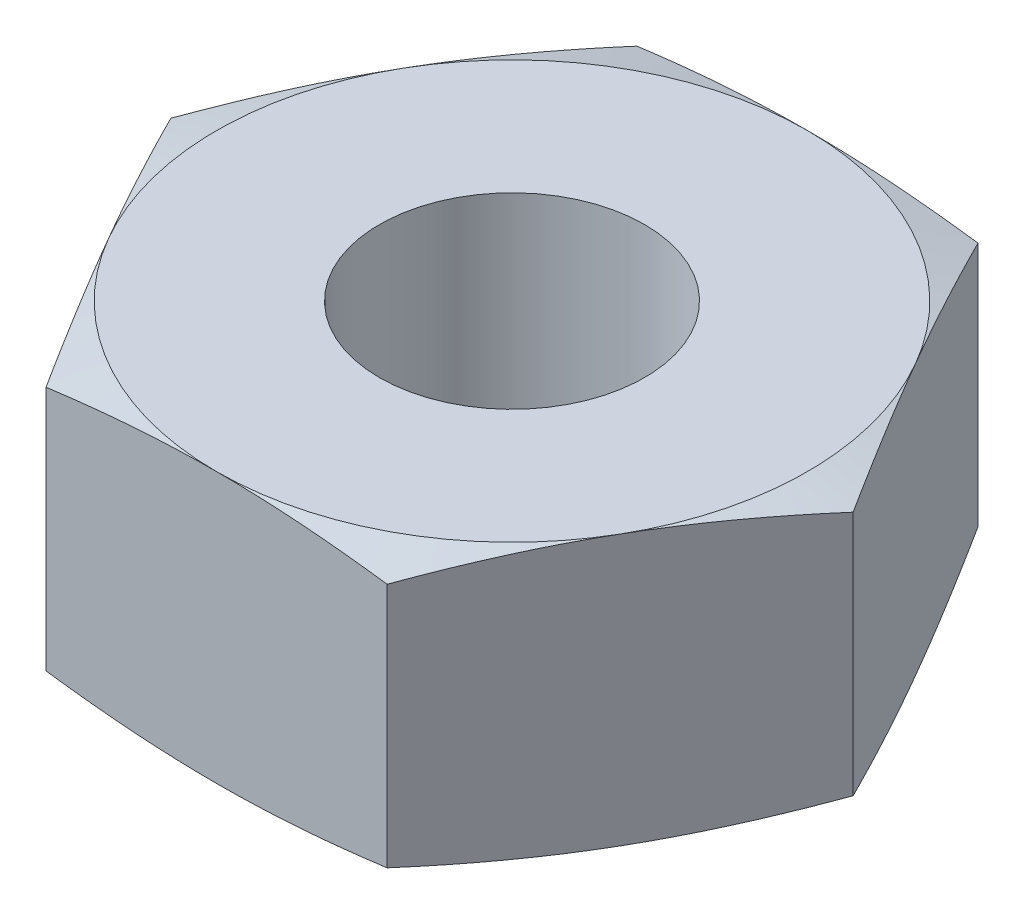
ISO-10303-21;
HEADER;
FILE_DESCRIPTION(('STEP AP214'),'2;1');
FILE_NAME('part.step','',(''),(''),'','','');
FILE_SCHEMA(('AUTOMOTIVE_DESIGN { 1 0 10303 214 1 1 1 1 }'));
ENDSEC;
DATA;
#1=APPLICATION_CONTEXT('core data for automotive mechanical design processes');
#2=APPLICATION_PROTOCOL_DEFINITION('international standard','automotive_design',2000,#1);
#3=PRODUCT_CONTEXT('',#1,'mechanical');
#4=PRODUCT('Part','Part','',(#3));
#5=PRODUCT_RELATED_PRODUCT_CATEGORY('part','',(#4));
#6=PRODUCT_DEFINITION_FORMATION('','',#4);
#7=PRODUCT_DEFINITION_CONTEXT('part definition',#1,'design');
#8=PRODUCT_DEFINITION('design','',#6,#7);
#9=PRODUCT_DEFINITION_SHAPE('','',#8);
#10=(LENGTH_UNIT() NAMED_UNIT(*) SI_UNIT(.MILLI.,.METRE.));
#11=(NAMED_UNIT(*) PLANE_ANGLE_UNIT() SI_UNIT($,.RADIAN.));
#12=(NAMED_UNIT(*) SI_UNIT($,.STERADIAN.) SOLID_ANGLE_UNIT());
#13=UNCERTAINTY_MEASURE_WITH_UNIT(LENGTH_MEASURE(1.E-05),#10,'distance_accuracy_value','');
#14=(GEOMETRIC_REPRESENTATION_CONTEXT(3) GLOBAL_UNCERTAINTY_ASSIGNED_CONTEXT((#13)) GLOBAL_UNIT_ASSIGNED_CONTEXT((#10,
#11,#12)) REPRESENTATION_CONTEXT('',''));
#15=CARTESIAN_POINT('',(0.,0.,0.));
#16=DIRECTION('',(0.,0.,1.));
#17=DIRECTION('',(1.,0.,0.));
#18=AXIS2_PLACEMENT_3D('',#15,#16,#17);
#19=CARTESIAN_POINT('',(2.02072594216369,1.6,3.5));
#20=DIRECTION('',(-0.866025403784439,0.,-0.5));
#21=DIRECTION('',(-0.5,0.,0.866025403784439));
#22=AXIS2_PLACEMENT_3D('',#19,#20,#21);
#23=PLANE('',#22);
#24=CARTESIAN_POINT('',(4.04156735438122,-1.45488746342053,-0.000199999999999409));
#25=CARTESIAN_POINT('',(3.95764212282385,-1.47738559382203,0.145162765094346));
#26=CARTESIAN_POINT('',(3.87356471593575,-1.49781025450599,0.290789105593173));
#27=CARTESIAN_POINT('',(3.70511294932748,-1.53369455339474,0.582556123983438));
#28=CARTESIAN_POINT('',(3.62073848299856,-1.54915217450553,0.728696986526637));
#29=CARTESIAN_POINT('',(3.45220420868617,-1.57419991225359,1.02060691245245));
#30=CARTESIAN_POINT('',(3.3680455405573,-1.58381990209049,1.16637400154898));
#31=CARTESIAN_POINT('',(3.19962087008055,-1.59671933246687,1.45809408806274));
#32=CARTESIAN_POINT('',(3.11535489166304,-1.60000000000001,1.60404704403137));
#33=CARTESIAN_POINT('',(2.94682293482803,-1.60000000000001,1.89595295596863));
#34=CARTESIAN_POINT('',(2.86255695641052,-1.59671933246687,2.04190591193726));
#35=CARTESIAN_POINT('',(2.69413228593377,-1.58381990209049,2.33362599845102));
#36=CARTESIAN_POINT('',(2.6099736178049,-1.57419991225359,2.47939308754756));
#37=CARTESIAN_POINT('',(2.44143934349251,-1.54915217450553,2.77130301347336));
#38=CARTESIAN_POINT('',(2.35706487716359,-1.53369455339474,2.91744387601656));
#39=CARTESIAN_POINT('',(2.18861311055532,-1.49781025450599,3.20921089440683));
#40=CARTESIAN_POINT('',(2.10453570366722,-1.47738559382203,3.35483723490566));
#41=CARTESIAN_POINT('',(2.02061047210985,-1.45488746342053,3.5002));
#42=B_SPLINE_CURVE_WITH_KNOTS('',3,(#24,#25,#26,#27,#28,#29,#30,#31,#32,#33,#34,#35,#36,#37,#38,
#39,#40,#41),.UNSPECIFIED.,.F.,.F.,(4,2,2,2,2,2,2,2,4),(0.,0.508081243376834,1.01636855642799,
1.52203235492776,2.02759827097034,2.53316418701292,3.03882798551268,3.54711529856384,
4.05519654194067),.UNSPECIFIED.);
#43=CARTESIAN_POINT('',(4.04145188432738,-1.45491840485418,0.));
#44=VERTEX_POINT('',#43);
#45=CARTESIAN_POINT('',(3.03108891324554,-1.6,1.75));
#46=VERTEX_POINT('',#45);
#47=EDGE_CURVE('E54',#44,#46,#42,.T.);
#48=ORIENTED_EDGE('',*,*,#47,.F.);
#49=DIRECTION('',(0.,-1.,0.));
#50=VECTOR('',#49,1.);
#51=CARTESIAN_POINT('',(4.04145188432738,1.6,0.));
#52=LINE('',#51,#50);
#53=CARTESIAN_POINT('',(4.04145188432738,1.45491840485418,0.));
#54=VERTEX_POINT('',#53);
#55=EDGE_CURVE('E171',#54,#44,#52,.T.);
#56=ORIENTED_EDGE('',*,*,#55,.F.);
#57=CARTESIAN_POINT('',(2.02061047210985,1.45488746342053,3.5002));
#58=CARTESIAN_POINT('',(2.10453570366722,1.47738559382203,3.35483723490566));
#59=CARTESIAN_POINT('',(2.18861311055532,1.49781025450599,3.20921089440683));
#60=CARTESIAN_POINT('',(2.35706487716359,1.53369455339474,2.91744387601656));
#61=CARTESIAN_POINT('',(2.44143934349251,1.54915217450553,2.77130301347337));
#62=CARTESIAN_POINT('',(2.6099736178049,1.57419991225359,2.47939308754756));
#63=CARTESIAN_POINT('',(2.69413228593377,1.58381990209049,2.33362599845102));
#64=CARTESIAN_POINT('',(2.86255695641052,1.59671933246687,2.04190591193726));
#65=CARTESIAN_POINT('',(2.94682293482802,1.6,1.89595295596863));
#66=CARTESIAN_POINT('',(3.11535489166304,1.6,1.60404704403137));
#67=CARTESIAN_POINT('',(3.19962087008055,1.59671933246687,1.45809408806274));
#68=CARTESIAN_POINT('',(3.3680455405573,1.58381990209049,1.16637400154898));
#69=CARTESIAN_POINT('',(3.45220420868617,1.57419991225359,1.02060691245245));
#70=CARTESIAN_POINT('',(3.62073848299856,1.54915217450553,0.728696986526638));
#71=CARTESIAN_POINT('',(3.70511294932748,1.53369455339474,0.582556123983439));
#72=CARTESIAN_POINT('',(3.87356471593575,1.49781025450599,0.290789105593173));
#73=CARTESIAN_POINT('',(3.95764212282385,1.47738559382203,0.145162765094347));
#74=CARTESIAN_POINT('',(4.04156735438122,1.45488746342054,-0.000199999999998981));
#75=B_SPLINE_CURVE_WITH_KNOTS('',3,(#57,#58,#59,#60,#61,#62,#63,#64,#65,#66,#67,#68,#69,#70,#71,
#72,#73,#74),.UNSPECIFIED.,.F.,.F.,(4,2,2,2,2,2,2,2,4),(0.,0.508081243376833,1.01636855642799,
1.52203235492776,2.02759827097034,2.53316418701292,3.03882798551268,3.54711529856384,
4.05519654194067),.UNSPECIFIED.);
#76=CARTESIAN_POINT('',(3.03108891324554,1.6,1.75));
#77=VERTEX_POINT('',#76);
#78=EDGE_CURVE('E262',#77,#54,#75,.T.);
#79=ORIENTED_EDGE('',*,*,#78,.F.);
#80=CARTESIAN_POINT('',(2.0207259421637,1.45491840485418,3.5));
#81=VERTEX_POINT('',#80);
#82=EDGE_CURVE('E162',#81,#77,#75,.T.);
#83=ORIENTED_EDGE('',*,*,#82,.F.);
#84=DIRECTION('',(0.,-1.,0.));
#85=VECTOR('',#84,1.);
#86=CARTESIAN_POINT('',(2.02072594216369,1.6,3.5));
#87=LINE('',#86,#85);
#88=CARTESIAN_POINT('',(2.0207259421637,-1.45491840485418,3.5));
#89=VERTEX_POINT('',#88);
#90=EDGE_CURVE('E157',#81,#89,#87,.T.);
#91=ORIENTED_EDGE('',*,*,#90,.T.);
#92=EDGE_CURVE('E149',#46,#89,#42,.T.);
#93=ORIENTED_EDGE('',*,*,#92,.F.);
#94=EDGE_LOOP('',(#48,#56,#79,#83,#91,#93));
#95=FACE_BOUND('',#94,.T.);
#96=ADVANCED_FACE('F38',(#95),#23,.F.);
#97=CARTESIAN_POINT('',(4.04145188432738,1.6,0.));
#98=DIRECTION('',(-0.866025403784439,0.,0.5));
#99=DIRECTION('',(0.5,0.,0.866025403784439));
#100=AXIS2_PLACEMENT_3D('',#97,#98,#99);
#101=PLANE('',#100);
#102=CARTESIAN_POINT('',(2.02061047210985,-1.45488746342053,-3.5002));
#103=CARTESIAN_POINT('',(2.10453570366722,-1.47738559382203,-3.35483723490565));
#104=CARTESIAN_POINT('',(2.18861311055532,-1.49781025450599,-3.20921089440683));
#105=CARTESIAN_POINT('',(2.35706487716359,-1.53369455339474,-2.91744387601656));
#106=CARTESIAN_POINT('',(2.44143934349251,-1.54915217450553,-2.77130301347336));
#107=CARTESIAN_POINT('',(2.6099736178049,-1.57419991225359,-2.47939308754755));
#108=CARTESIAN_POINT('',(2.69413228593377,-1.58381990209049,-2.33362599845102));
#109=CARTESIAN_POINT('',(2.86255695641052,-1.59671933246687,-2.04190591193726));
#110=CARTESIAN_POINT('',(2.94682293482803,-1.6,-1.89595295596863));
#111=CARTESIAN_POINT('',(3.11535489166304,-1.6,-1.60404704403137));
#112=CARTESIAN_POINT('',(3.19962087008055,-1.59671933246687,-1.45809408806274));
#113=CARTESIAN_POINT('',(3.3680455405573,-1.58381990209049,-1.16637400154898));
#114=CARTESIAN_POINT('',(3.45220420868617,-1.57419991225359,-1.02060691245245));
#115=CARTESIAN_POINT('',(3.62073848299856,-1.54915217450553,-0.728696986526637));
#116=CARTESIAN_POINT('',(3.70511294932748,-1.53369455339474,-0.582556123983437));
#117=CARTESIAN_POINT('',(3.87356471593575,-1.49781025450599,-0.290789105593172));
#118=CARTESIAN_POINT('',(3.95764212282385,-1.47738559382203,-0.145162765094346));
#119=CARTESIAN_POINT('',(4.04156735438122,-1.45488746342054,0.000200000000000651));
#120=B_SPLINE_CURVE_WITH_KNOTS('',3,(#102,#103,#104,#105,#106,#107,#108,#109,#110,#111,#112,
#113,#114,#115,#116,#117,#118,#119),.UNSPECIFIED.,.F.,.F.,(4,2,2,2,2,2,2,2,4),(0.,
0.508081243376834,1.016368556428,1.52203235492776,2.02759827097034,2.53316418701292,
3.03882798551268,3.54711529856384,4.05519654194067),.UNSPECIFIED.);
#121=CARTESIAN_POINT('',(2.02072594216369,-1.45491840485418,-3.50000000000001));
#122=VERTEX_POINT('',#121);
#123=CARTESIAN_POINT('',(3.03108891324554,-1.6,-1.75));
#124=VERTEX_POINT('',#123);
#125=EDGE_CURVE('E61',#122,#124,#120,.T.);
#126=ORIENTED_EDGE('',*,*,#125,.F.);
#127=DIRECTION('',(0.,-1.,0.));
#128=VECTOR('',#127,1.);
#129=CARTESIAN_POINT('',(2.02072594216369,1.6,-3.5));
#130=LINE('',#129,#128);
#131=CARTESIAN_POINT('',(2.0207259421637,1.45491840485418,-3.5));
#132=VERTEX_POINT('',#131);
#133=EDGE_CURVE('E168',#132,#122,#130,.T.);
#134=ORIENTED_EDGE('',*,*,#133,.F.);
#135=CARTESIAN_POINT('',(4.04156735438122,1.45488746342053,0.000200000000000182));
#136=CARTESIAN_POINT('',(3.95764212282385,1.47738559382203,-0.145162765094346));
#137=CARTESIAN_POINT('',(3.87356471593575,1.49781025450599,-0.290789105593172));
#138=CARTESIAN_POINT('',(3.70511294932748,1.53369455339474,-0.582556123983438));
#139=CARTESIAN_POINT('',(3.62073848299856,1.54915217450553,-0.728696986526637));
#140=CARTESIAN_POINT('',(3.45220420868617,1.57419991225359,-1.02060691245245));
#141=CARTESIAN_POINT('',(3.3680455405573,1.58381990209049,-1.16637400154898));
#142=CARTESIAN_POINT('',(3.19962087008055,1.59671933246687,-1.45809408806274));
#143=CARTESIAN_POINT('',(3.11535489166304,1.60000000000001,-1.60404704403137));
#144=CARTESIAN_POINT('',(2.94682293482803,1.60000000000001,-1.89595295596863));
#145=CARTESIAN_POINT('',(2.86255695641052,1.59671933246687,-2.04190591193726));
#146=CARTESIAN_POINT('',(2.69413228593377,1.58381990209049,-2.33362599845102));
#147=CARTESIAN_POINT('',(2.6099736178049,1.57419991225359,-2.47939308754755));
#148=CARTESIAN_POINT('',(2.44143934349251,1.54915217450553,-2.77130301347336));
#149=CARTESIAN_POINT('',(2.35706487716359,1.53369455339474,-2.91744387601656));
#150=CARTESIAN_POINT('',(2.18861311055532,1.49781025450599,-3.20921089440683));
#151=CARTESIAN_POINT('',(2.10453570366722,1.47738559382203,-3.35483723490565));
#152=CARTESIAN_POINT('',(2.02061047210985,1.45488746342053,-3.5002));
#153=B_SPLINE_CURVE_WITH_KNOTS('',3,(#135,#136,#137,#138,#139,#140,#141,#142,#143,#144,#145,
#146,#147,#148,#149,#150,#151,#152),.UNSPECIFIED.,.F.,.F.,(4,2,2,2,2,2,2,2,4),(0.,
0.508081243376834,1.01636855642799,1.52203235492776,2.02759827097034,2.53316418701292,
3.03882798551268,3.54711529856384,4.05519654194067),.UNSPECIFIED.);
#154=CARTESIAN_POINT('',(3.03108891324554,1.6,-1.75));
#155=VERTEX_POINT('',#154);
#156=EDGE_CURVE('E256',#155,#132,#153,.T.);
#157=ORIENTED_EDGE('',*,*,#156,.F.);
#158=EDGE_CURVE('E260',#54,#155,#153,.T.);
#159=ORIENTED_EDGE('',*,*,#158,.F.);
#160=ORIENTED_EDGE('',*,*,#55,.T.);
#161=EDGE_CURVE('E274',#124,#44,#120,.T.);
#162=ORIENTED_EDGE('',*,*,#161,.F.);
#163=EDGE_LOOP('',(#126,#134,#157,#159,#160,#162));
#164=FACE_BOUND('',#163,.T.);
#165=ADVANCED_FACE('F266',(#164),#101,.F.);
#166=CARTESIAN_POINT('',(2.02072594216369,1.6,-3.5));
#167=DIRECTION('',(0.,0.,1.));
#168=DIRECTION('',(1.,0.,0.));
#169=AXIS2_PLACEMENT_3D('',#166,#167,#168);
#170=PLANE('',#169);
#171=CARTESIAN_POINT('',(-5.44794165387883,-0.802759219121572,-3.5));
#172=CARTESIAN_POINT('',(-5.28787944005606,-0.838833506686663,-3.5));
#173=CARTESIAN_POINT('',(-5.12771986140729,-0.874483249848462,-3.5));
#174=CARTESIAN_POINT('',(-4.80715789763999,-0.944704151216025,-3.5));
#175=CARTESIAN_POINT('',(-4.64675550294617,-0.979275265660306,-3.5));
#176=CARTESIAN_POINT('',(-4.32553499190003,-1.04713556451647,-3.5));
#177=CARTESIAN_POINT('',(-4.16471663689008,-1.08042362309612,-3.5));
#178=CARTESIAN_POINT('',(-3.84275237191593,-1.14537529032003,-3.5));
#179=CARTESIAN_POINT('',(-3.6816064645399,-1.17703891174843,-3.5));
#180=CARTESIAN_POINT('',(-3.36037189085155,-1.23807830273547,-3.5));
#181=CARTESIAN_POINT('',(-3.20028664501665,-1.26747198826896,-3.5));
#182=CARTESIAN_POINT('',(-2.87968547460581,-1.32380413242379,-3.5));
#183=CARTESIAN_POINT('',(-2.71916955912038,-1.35074264245544,-3.5));
#184=CARTESIAN_POINT('',(-2.39766115808484,-1.40158045759508,-3.5));
#185=CARTESIAN_POINT('',(-2.2366686962566,-1.42547991146413,-3.5));
#186=CARTESIAN_POINT('',(-1.91416660910466,-1.4695545661189,-3.5));
#187=CARTESIAN_POINT('',(-1.75265697552332,-1.48972970713404,-3.5));
#188=CARTESIAN_POINT('',(-1.42723816414199,-1.52580995624861,-3.5));
#189=CARTESIAN_POINT('',(-1.26332304518374,-1.54166225930532,-3.5));
#190=CARTESIAN_POINT('',(-0.935069761815876,-1.5680139939947,-3.5));
#191=CARTESIAN_POINT('',(-0.77073163526216,-1.57851388895893,-3.5));
#192=CARTESIAN_POINT('',(-0.441865309169314,-1.59355196935843,-3.5));
#193=CARTESIAN_POINT('',(-0.277337258285922,-1.5980933401484,-3.5));
#194=CARTESIAN_POINT('',(0.0517733682332413,-1.60093312640938,-3.5));
#195=CARTESIAN_POINT('',(0.216355943705047,-1.5992315604867,-3.5));
#196=CARTESIAN_POINT('',(0.546098106792446,-1.58967493352251,-3.5));
#197=CARTESIAN_POINT('',(0.71125685625703,-1.58179153808297,-3.5));
#198=CARTESIAN_POINT('',(1.0412049060427,-1.56032278027866,-3.5));
#199=CARTESIAN_POINT('',(1.20599418623684,-1.54673711452056,-3.5));
#200=CARTESIAN_POINT('',(1.53520132339961,-1.51457518215612,-3.5));
#201=CARTESIAN_POINT('',(1.6996188117597,-1.49599520158007,-3.5));
#202=CARTESIAN_POINT('',(2.02791869152128,-1.45464926155375,-3.5));
#203=CARTESIAN_POINT('',(2.1918010855413,-1.43188332261903,-3.5));
#204=CARTESIAN_POINT('',(2.55773878979597,-1.37714075022119,-3.5));
#205=CARTESIAN_POINT('',(2.75965770767667,-1.3442590576039,-3.5));
#206=CARTESIAN_POINT('',(3.16280506821541,-1.2744860233325,-3.5));
#207=CARTESIAN_POINT('',(3.36403346893582,-1.23759444243856,-3.5));
#208=CARTESIAN_POINT('',(3.76594446303811,-1.16074821773512,-3.5));
#209=CARTESIAN_POINT('',(3.96662693324336,-1.1207929338427,-3.5));
#210=CARTESIAN_POINT('',(4.36751204510024,-1.03853651336037,-3.5));
#211=CARTESIAN_POINT('',(4.56771467692626,-0.996235329154601,-3.5));
#212=CARTESIAN_POINT('',(5.16798904024747,-0.866594178897146,-3.5));
#213=CARTESIAN_POINT('',(5.56747861340178,-0.776565670724137,-3.5));
#214=CARTESIAN_POINT('',(6.3653799972808,-0.592138243986172,-3.5));
#215=CARTESIAN_POINT('',(6.76379194254003,-0.497739900407909,-3.5));
#216=CARTESIAN_POINT('',(7.55369204976309,-0.307578244870878,-3.5));
#217=CARTESIAN_POINT('',(7.94519095111558,-0.211859444351146,-3.5));
#218=CARTESIAN_POINT('',(8.72773476710705,-0.018522164870488,-3.5));
#219=CARTESIAN_POINT('',(9.11877966270979,0.0790963909001356,-3.5));
#220=CARTESIAN_POINT('',(9.89975451609434,0.275477181032252,-3.5));
#221=CARTESIAN_POINT('',(10.2896851442499,0.374236753673143,-3.5));
#222=CARTESIAN_POINT('',(11.0692718287081,0.572750394754799,-3.5));
#223=CARTESIAN_POINT('',(11.4589278981786,0.672504411453289,-3.5));
#224=CARTESIAN_POINT('',(11.8484975559015,0.772591086769964,-3.5));
#225=B_SPLINE_CURVE_WITH_KNOTS('',3,(#171,#172,#173,#174,#175,#176,#177,#178,#179,#180,#181,
#182,#183,#184,#185,#186,#187,#188,#189,#190,#191,#192,#193,#194,#195,#196,#197,#198,#199,#200,
#201,#202,#203,#204,#205,#206,#207,#208,#209,#210,#211,#212,#213,#214,#215,#216,#217,#218,#219,
#220,#221,#222,#223,#224),.UNSPECIFIED.,.F.,.F.,(4,2,2,2,2,2,2,2,2,2,2,2,2,2,2,2,2,2,2,2,2,2,2,
2,2,2,4),(0.,0.492232922608383,0.984485789897494,1.47716118860718,1.96983270942275,
2.45810167830622,2.94636042069629,3.43459525373252,3.92283792164948,4.41680166455133,
4.91072264018276,5.40437946392539,5.89803481638425,6.39396615707215,6.88992388748396,
7.38625145689028,7.88257659383844,8.4962570871316,9.10997421423646,9.72381991315014,
10.3376780761461,11.56615452824,12.7944697932781,14.0035535640047,15.2126863216193,
16.4194135198414,17.6260782547595),.UNSPECIFIED.);
#226=CARTESIAN_POINT('',(-2.02072594216369,-1.45491840485418,-3.50000000000001));
#227=VERTEX_POINT('',#226);
#228=CARTESIAN_POINT('',(0.,-1.6,-3.5));
#229=VERTEX_POINT('',#228);
#230=EDGE_CURVE('E289',#227,#229,#225,.T.);
#231=ORIENTED_EDGE('',*,*,#230,.F.);
#232=DIRECTION('',(0.,-1.,0.));
#233=VECTOR('',#232,1.);
#234=CARTESIAN_POINT('',(-2.02072594216369,1.6,-3.5));
#235=LINE('',#234,#233);
#236=CARTESIAN_POINT('',(-2.02072594216369,1.45491840485418,-3.50000000000001));
#237=VERTEX_POINT('',#236);
#238=EDGE_CURVE('E159',#237,#227,#235,.T.);
#239=ORIENTED_EDGE('',*,*,#238,.F.);
#240=CARTESIAN_POINT('',(-5.44794165387883,0.802759219121572,-3.5));
#241=CARTESIAN_POINT('',(-5.28787944005606,0.838833506686663,-3.5));
#242=CARTESIAN_POINT('',(-5.12771986140729,0.874483249848462,-3.5));
#243=CARTESIAN_POINT('',(-4.80715789763999,0.944704151216025,-3.5));
#244=CARTESIAN_POINT('',(-4.64675550294617,0.979275265660306,-3.5));
#245=CARTESIAN_POINT('',(-4.32553499190003,1.04713556451647,-3.5));
#246=CARTESIAN_POINT('',(-4.16471663689008,1.08042362309612,-3.5));
#247=CARTESIAN_POINT('',(-3.84275237191593,1.14537529032003,-3.5));
#248=CARTESIAN_POINT('',(-3.6816064645399,1.17703891174843,-3.5));
#249=CARTESIAN_POINT('',(-3.36037189085155,1.23807830273547,-3.5));
#250=CARTESIAN_POINT('',(-3.20028664501665,1.26747198826896,-3.5));
#251=CARTESIAN_POINT('',(-2.87968547460581,1.32380413242379,-3.5));
#252=CARTESIAN_POINT('',(-2.71916955912038,1.35074264245544,-3.5));
#253=CARTESIAN_POINT('',(-2.39766115808484,1.40158045759508,-3.5));
#254=CARTESIAN_POINT('',(-2.2366686962566,1.42547991146413,-3.5));
#255=CARTESIAN_POINT('',(-1.91416660910466,1.4695545661189,-3.5));
#256=CARTESIAN_POINT('',(-1.75265697552332,1.48972970713404,-3.5));
#257=CARTESIAN_POINT('',(-1.42723816414199,1.52580995624861,-3.5));
#258=CARTESIAN_POINT('',(-1.26332304518374,1.54166225930532,-3.5));
#259=CARTESIAN_POINT('',(-0.935069761815876,1.5680139939947,-3.5));
#260=CARTESIAN_POINT('',(-0.77073163526216,1.57851388895893,-3.5));
#261=CARTESIAN_POINT('',(-0.441865309169314,1.59355196935843,-3.5));
#262=CARTESIAN_POINT('',(-0.277337258285922,1.5980933401484,-3.5));
#263=CARTESIAN_POINT('',(0.0517733682332413,1.60093312640938,-3.5));
#264=CARTESIAN_POINT('',(0.216355943705047,1.5992315604867,-3.5));
#265=CARTESIAN_POINT('',(0.546098106792446,1.58967493352251,-3.5));
#266=CARTESIAN_POINT('',(0.71125685625703,1.58179153808297,-3.5));
#267=CARTESIAN_POINT('',(1.0412049060427,1.56032278027866,-3.5));
#268=CARTESIAN_POINT('',(1.20599418623684,1.54673711452056,-3.5));
#269=CARTESIAN_POINT('',(1.53520132339961,1.51457518215612,-3.5));
#270=CARTESIAN_POINT('',(1.6996188117597,1.49599520158007,-3.5));
#271=CARTESIAN_POINT('',(2.02791869152128,1.45464926155375,-3.5));
#272=CARTESIAN_POINT('',(2.1918010855413,1.43188332261903,-3.5));
#273=CARTESIAN_POINT('',(2.55773878979597,1.37714075022119,-3.5));
#274=CARTESIAN_POINT('',(2.75965770767667,1.3442590576039,-3.5));
#275=CARTESIAN_POINT('',(3.16280506821541,1.2744860233325,-3.5));
#276=CARTESIAN_POINT('',(3.36403346893582,1.23759444243856,-3.5));
#277=CARTESIAN_POINT('',(3.76594446303811,1.16074821773512,-3.5));
#278=CARTESIAN_POINT('',(3.96662693324336,1.1207929338427,-3.5));
#279=CARTESIAN_POINT('',(4.36751204510024,1.03853651336037,-3.5));
#280=CARTESIAN_POINT('',(4.56771467692626,0.996235329154601,-3.5));
#281=CARTESIAN_POINT('',(5.16798904024747,0.866594178897146,-3.5));
#282=CARTESIAN_POINT('',(5.56747861340178,0.776565670724137,-3.5));
#283=CARTESIAN_POINT('',(6.3653799972808,0.592138243986172,-3.5));
#284=CARTESIAN_POINT('',(6.76379194254003,0.497739900407909,-3.5));
#285=CARTESIAN_POINT('',(7.55369204976309,0.307578244870878,-3.5));
#286=CARTESIAN_POINT('',(7.94519095111558,0.211859444351146,-3.5));
#287=CARTESIAN_POINT('',(8.72773476710705,0.018522164870488,-3.5));
#288=CARTESIAN_POINT('',(9.11877966270979,-0.0790963909001356,-3.5));
#289=CARTESIAN_POINT('',(9.89975451609434,-0.275477181032252,-3.5));
#290=CARTESIAN_POINT('',(10.2896851442499,-0.374236753673143,-3.5));
#291=CARTESIAN_POINT('',(11.0692718287081,-0.572750394754799,-3.5));
#292=CARTESIAN_POINT('',(11.4589278981786,-0.672504411453289,-3.5));
#293=CARTESIAN_POINT('',(11.8484975559015,-0.772591086769964,-3.5));
#294=B_SPLINE_CURVE_WITH_KNOTS('',3,(#240,#241,#242,#243,#244,#245,#246,#247,#248,#249,#250,
#251,#252,#253,#254,#255,#256,#257,#258,#259,#260,#261,#262,#263,#264,#265,#266,#267,#268,#269,
#270,#271,#272,#273,#274,#275,#276,#277,#278,#279,#280,#281,#282,#283,#284,#285,#286,#287,#288,
#289,#290,#291,#292,#293),.UNSPECIFIED.,.F.,.F.,(4,2,2,2,2,2,2,2,2,2,2,2,2,2,2,2,2,2,2,2,2,2,2,
2,2,2,4),(0.,0.492232922608383,0.984485789897494,1.47716118860718,1.96983270942275,
2.45810167830622,2.94636042069629,3.43459525373252,3.92283792164948,4.41680166455133,
4.91072264018276,5.40437946392539,5.89803481638425,6.39396615707215,6.88992388748396,
7.38625145689028,7.88257659383844,8.4962570871316,9.10997421423646,9.72381991315014,
10.3376780761461,11.56615452824,12.7944697932781,14.0035535640047,15.2126863216193,
16.4194135198414,17.6260782547595),.UNSPECIFIED.);
#295=CARTESIAN_POINT('',(0.,1.6,-3.5));
#296=VERTEX_POINT('',#295);
#297=EDGE_CURVE('E213',#296,#237,#294,.F.);
#298=ORIENTED_EDGE('',*,*,#297,.F.);
#299=EDGE_CURVE('E261',#132,#296,#294,.F.);
#300=ORIENTED_EDGE('',*,*,#299,.F.);
#301=ORIENTED_EDGE('',*,*,#133,.T.);
#302=EDGE_CURVE('E285',#229,#122,#225,.T.);
#303=ORIENTED_EDGE('',*,*,#302,.F.);
#304=EDGE_LOOP('',(#231,#239,#298,#300,#301,#303));
#305=FACE_BOUND('',#304,.T.);
#306=ADVANCED_FACE('F269',(#305),#170,.F.);
#307=CARTESIAN_POINT('',(-2.02072594216369,1.6,-3.5));
#308=DIRECTION('',(0.866025403784439,0.,0.5));
#309=DIRECTION('',(0.5,0.,-0.866025403784439));
#310=AXIS2_PLACEMENT_3D('',#307,#308,#309);
#311=PLANE('',#310);
#312=CARTESIAN_POINT('',(-4.04156735438122,-1.45488746342053,0.000199999999999236));
#313=CARTESIAN_POINT('',(-3.95764212282385,-1.47738559382203,-0.145162765094347));
#314=CARTESIAN_POINT('',(-3.87356471593575,-1.49781025450599,-0.290789105593173));
#315=CARTESIAN_POINT('',(-3.70511294932748,-1.53369455339474,-0.582556123983438));
#316=CARTESIAN_POINT('',(-3.62073848299856,-1.54915217450553,-0.728696986526637));
#317=CARTESIAN_POINT('',(-3.45220420868617,-1.57419991225359,-1.02060691245245));
#318=CARTESIAN_POINT('',(-3.3680455405573,-1.58381990209049,-1.16637400154898));
#319=CARTESIAN_POINT('',(-3.19962087008055,-1.59671933246687,-1.45809408806274));
#320=CARTESIAN_POINT('',(-3.11535489166305,-1.60000000000001,-1.60404704403137));
#321=CARTESIAN_POINT('',(-2.94682293482803,-1.60000000000001,-1.89595295596863));
#322=CARTESIAN_POINT('',(-2.86255695641052,-1.59671933246687,-2.04190591193726));
#323=CARTESIAN_POINT('',(-2.69413228593377,-1.58381990209049,-2.33362599845102));
#324=CARTESIAN_POINT('',(-2.6099736178049,-1.57419991225359,-2.47939308754756));
#325=CARTESIAN_POINT('',(-2.44143934349251,-1.54915217450553,-2.77130301347336));
#326=CARTESIAN_POINT('',(-2.35706487716359,-1.53369455339474,-2.91744387601656));
#327=CARTESIAN_POINT('',(-2.18861311055532,-1.49781025450599,-3.20921089440683));
#328=CARTESIAN_POINT('',(-2.10453570366722,-1.47738559382203,-3.35483723490565));
#329=CARTESIAN_POINT('',(-2.02061047210985,-1.45488746342054,-3.5002));
#330=B_SPLINE_CURVE_WITH_KNOTS('',3,(#312,#313,#314,#315,#316,#317,#318,#319,#320,#321,#322,
#323,#324,#325,#326,#327,#328,#329),.UNSPECIFIED.,.F.,.F.,(4,2,2,2,2,2,2,2,4),(0.,
0.508081243376833,1.01636855642799,1.52203235492776,2.02759827097034,2.53316418701292,
3.03882798551268,3.54711529856384,4.05519654194067),.UNSPECIFIED.);
#331=CARTESIAN_POINT('',(-4.04145188432738,-1.45491840485418,0.));
#332=VERTEX_POINT('',#331);
#333=CARTESIAN_POINT('',(-3.03108891324554,-1.6,-1.75));
#334=VERTEX_POINT('',#333);
#335=EDGE_CURVE('E280',#332,#334,#330,.T.);
#336=ORIENTED_EDGE('',*,*,#335,.F.);
#337=DIRECTION('',(0.,-1.,0.));
#338=VECTOR('',#337,1.);
#339=CARTESIAN_POINT('',(-4.04145188432738,1.6,0.));
#340=LINE('',#339,#338);
#341=CARTESIAN_POINT('',(-4.04145188432738,1.45491840485418,0.));
#342=VERTEX_POINT('',#341);
#343=EDGE_CURVE('E156',#342,#332,#340,.T.);
#344=ORIENTED_EDGE('',*,*,#343,.F.);
#345=CARTESIAN_POINT('',(-2.02061047210985,1.45488746342053,-3.5002));
#346=CARTESIAN_POINT('',(-2.10453570366722,1.47738559382203,-3.35483723490566));
#347=CARTESIAN_POINT('',(-2.18861311055532,1.49781025450599,-3.20921089440683));
#348=CARTESIAN_POINT('',(-2.35706487716359,1.53369455339474,-2.91744387601656));
#349=CARTESIAN_POINT('',(-2.44143934349251,1.54915217450553,-2.77130301347336));
#350=CARTESIAN_POINT('',(-2.6099736178049,1.57419991225359,-2.47939308754756));
#351=CARTESIAN_POINT('',(-2.69413228593377,1.58381990209049,-2.33362599845102));
#352=CARTESIAN_POINT('',(-2.86255695641052,1.59671933246687,-2.04190591193726));
#353=CARTESIAN_POINT('',(-2.94682293482803,1.6,-1.89595295596863));
#354=CARTESIAN_POINT('',(-3.11535489166305,1.6,-1.60404704403137));
#355=CARTESIAN_POINT('',(-3.19962087008056,1.59671933246687,-1.45809408806274));
#356=CARTESIAN_POINT('',(-3.3680455405573,1.58381990209049,-1.16637400154898));
#357=CARTESIAN_POINT('',(-3.45220420868617,1.57419991225359,-1.02060691245245));
#358=CARTESIAN_POINT('',(-3.62073848299856,1.54915217450553,-0.728696986526637));
#359=CARTESIAN_POINT('',(-3.70511294932748,1.53369455339474,-0.582556123983438));
#360=CARTESIAN_POINT('',(-3.87356471593575,1.49781025450599,-0.290789105593173));
#361=CARTESIAN_POINT('',(-3.95764212282385,1.47738559382203,-0.145162765094347));
#362=CARTESIAN_POINT('',(-4.04156735438122,1.45488746342054,0.000199999999999711));
#363=B_SPLINE_CURVE_WITH_KNOTS('',3,(#345,#346,#347,#348,#349,#350,#351,#352,#353,#354,#355,
#356,#357,#358,#359,#360,#361,#362),.UNSPECIFIED.,.F.,.F.,(4,2,2,2,2,2,2,2,4),(0.,
0.508081243376834,1.016368556428,1.52203235492776,2.02759827097034,2.53316418701292,
3.03882798551268,3.54711529856384,4.05519654194068),.UNSPECIFIED.);
#364=CARTESIAN_POINT('',(-3.03108891324554,1.6,-1.75));
#365=VERTEX_POINT('',#364);
#366=EDGE_CURVE('E201',#365,#342,#363,.T.);
#367=ORIENTED_EDGE('',*,*,#366,.F.);
#368=EDGE_CURVE('E204',#237,#365,#363,.T.);
#369=ORIENTED_EDGE('',*,*,#368,.F.);
#370=ORIENTED_EDGE('',*,*,#238,.T.);
#371=EDGE_CURVE('E290',#334,#227,#330,.T.);
#372=ORIENTED_EDGE('',*,*,#371,.F.);
#373=EDGE_LOOP('',(#336,#344,#367,#369,#370,#372));
#374=FACE_BOUND('',#373,.T.);
#375=ADVANCED_FACE('F203',(#374),#311,.F.);
#376=CARTESIAN_POINT('',(-4.04145188432738,1.6,0.));
#377=DIRECTION('',(0.866025403784439,0.,-0.5));
#378=DIRECTION('',(-0.5,0.,-0.866025403784439));
#379=AXIS2_PLACEMENT_3D('',#376,#377,#378);
#380=PLANE('',#379);
#381=CARTESIAN_POINT('',(-2.02061047210985,-1.45488746342053,3.5002));
#382=CARTESIAN_POINT('',(-2.10453570366722,-1.47738559382203,3.35483723490565));
#383=CARTESIAN_POINT('',(-2.18861311055532,-1.49781025450599,3.20921089440683));
#384=CARTESIAN_POINT('',(-2.35706487716359,-1.53369455339474,2.91744387601656));
#385=CARTESIAN_POINT('',(-2.44143934349251,-1.54915217450553,2.77130301347336));
#386=CARTESIAN_POINT('',(-2.6099736178049,-1.57419991225359,2.47939308754755));
#387=CARTESIAN_POINT('',(-2.69413228593377,-1.58381990209049,2.33362599845102));
#388=CARTESIAN_POINT('',(-2.86255695641052,-1.59671933246687,2.04190591193726));
#389=CARTESIAN_POINT('',(-2.94682293482803,-1.6,1.89595295596863));
#390=CARTESIAN_POINT('',(-3.11535489166305,-1.6,1.60404704403137));
#391=CARTESIAN_POINT('',(-3.19962087008055,-1.59671933246687,1.45809408806274));
#392=CARTESIAN_POINT('',(-3.3680455405573,-1.58381990209049,1.16637400154898));
#393=CARTESIAN_POINT('',(-3.45220420868617,-1.57419991225359,1.02060691245244));
#394=CARTESIAN_POINT('',(-3.62073848299856,-1.54915217450553,0.728696986526636));
#395=CARTESIAN_POINT('',(-3.70511294932748,-1.53369455339474,0.582556123983437));
#396=CARTESIAN_POINT('',(-3.87356471593575,-1.49781025450599,0.290789105593172));
#397=CARTESIAN_POINT('',(-3.95764212282385,-1.47738559382203,0.145162765094345));
#398=CARTESIAN_POINT('',(-4.04156735438122,-1.45488746342054,-0.000200000000000989));
#399=B_SPLINE_CURVE_WITH_KNOTS('',3,(#381,#382,#383,#384,#385,#386,#387,#388,#389,#390,#391,
#392,#393,#394,#395,#396,#397,#398),.UNSPECIFIED.,.F.,.F.,(4,2,2,2,2,2,2,2,4),(0.,
0.508081243376834,1.016368556428,1.52203235492776,2.02759827097034,2.53316418701292,
3.03882798551268,3.54711529856384,4.05519654194068),.UNSPECIFIED.);
#400=CARTESIAN_POINT('',(-2.0207259421637,-1.45491840485418,3.5));
#401=VERTEX_POINT('',#400);
#402=CARTESIAN_POINT('',(-3.03108891324554,-1.6,1.75));
#403=VERTEX_POINT('',#402);
#404=EDGE_CURVE('E132',#401,#403,#399,.T.);
#405=ORIENTED_EDGE('',*,*,#404,.F.);
#406=DIRECTION('',(0.,-1.,0.));
#407=VECTOR('',#406,1.);
#408=CARTESIAN_POINT('',(-2.02072594216369,1.6,3.5));
#409=LINE('',#408,#407);
#410=CARTESIAN_POINT('',(-2.0207259421637,1.45491840485418,3.5));
#411=VERTEX_POINT('',#410);
#412=EDGE_CURVE('E146',#411,#401,#409,.T.);
#413=ORIENTED_EDGE('',*,*,#412,.F.);
#414=CARTESIAN_POINT('',(-4.04156735438122,1.45488746342053,-0.000200000000000764));
#415=CARTESIAN_POINT('',(-3.95764212282385,1.47738559382203,0.145162765094345));
#416=CARTESIAN_POINT('',(-3.87356471593575,1.49781025450599,0.290789105593171));
#417=CARTESIAN_POINT('',(-3.70511294932748,1.53369455339474,0.582556123983437));
#418=CARTESIAN_POINT('',(-3.62073848299856,1.54915217450553,0.728696986526636));
#419=CARTESIAN_POINT('',(-3.45220420868617,1.57419991225359,1.02060691245244));
#420=CARTESIAN_POINT('',(-3.3680455405573,1.58381990209049,1.16637400154898));
#421=CARTESIAN_POINT('',(-3.19962087008056,1.59671933246687,1.45809408806274));
#422=CARTESIAN_POINT('',(-3.11535489166305,1.60000000000001,1.60404704403137));
#423=CARTESIAN_POINT('',(-2.94682293482803,1.60000000000001,1.89595295596863));
#424=CARTESIAN_POINT('',(-2.86255695641052,1.59671933246687,2.04190591193726));
#425=CARTESIAN_POINT('',(-2.69413228593377,1.58381990209049,2.33362599845102));
#426=CARTESIAN_POINT('',(-2.6099736178049,1.57419991225359,2.47939308754755));
#427=CARTESIAN_POINT('',(-2.44143934349251,1.54915217450553,2.77130301347336));
#428=CARTESIAN_POINT('',(-2.35706487716359,1.53369455339474,2.91744387601656));
#429=CARTESIAN_POINT('',(-2.18861311055532,1.49781025450599,3.20921089440683));
#430=CARTESIAN_POINT('',(-2.10453570366722,1.47738559382203,3.35483723490565));
#431=CARTESIAN_POINT('',(-2.02061047210985,1.45488746342053,3.5002));
#432=B_SPLINE_CURVE_WITH_KNOTS('',3,(#414,#415,#416,#417,#418,#419,#420,#421,#422,#423,#424,
#425,#426,#427,#428,#429,#430,#431),.UNSPECIFIED.,.F.,.F.,(4,2,2,2,2,2,2,2,4),(0.,
0.508081243376833,1.01636855642799,1.52203235492776,2.02759827097034,2.53316418701292,
3.03882798551268,3.54711529856384,4.05519654194067),.UNSPECIFIED.);
#433=CARTESIAN_POINT('',(-3.03108891324554,1.6,1.75));
#434=VERTEX_POINT('',#433);
#435=EDGE_CURVE('E214',#434,#411,#432,.T.);
#436=ORIENTED_EDGE('',*,*,#435,.F.);
#437=EDGE_CURVE('E209',#342,#434,#432,.T.);
#438=ORIENTED_EDGE('',*,*,#437,.F.);
#439=ORIENTED_EDGE('',*,*,#343,.T.);
#440=EDGE_CURVE('E148',#403,#332,#399,.T.);
#441=ORIENTED_EDGE('',*,*,#440,.F.);
#442=EDGE_LOOP('',(#405,#413,#436,#438,#439,#441));
#443=FACE_BOUND('',#442,.T.);
#444=ADVANCED_FACE('F144',(#443),#380,.F.);
#445=CARTESIAN_POINT('',(-2.02072594216369,1.6,3.5));
#446=DIRECTION('',(0.,0.,-1.));
#447=DIRECTION('',(-1.,0.,0.));
#448=AXIS2_PLACEMENT_3D('',#445,#446,#447);
#449=PLANE('',#448);
#450=CARTESIAN_POINT('',(-5.44794165118656,-0.802759219728502,3.5));
#451=CARTESIAN_POINT('',(-5.28787943747283,-0.838833507263815,3.5));
#452=CARTESIAN_POINT('',(-5.12771985893315,-0.874483250395943,3.5));
#453=CARTESIAN_POINT('',(-4.80715789538415,-0.944704151704591,3.5));
#454=CARTESIAN_POINT('',(-4.64675550079955,-0.97927526611963,3.5));
#455=CARTESIAN_POINT('',(-4.32553498997236,-1.04713556491788,3.5));
#456=CARTESIAN_POINT('',(-4.16471663507215,-1.08042362346887,3.5));
#457=CARTESIAN_POINT('',(-3.84275237031772,-1.14537529063645,3.5));
#458=CARTESIAN_POINT('',(-3.68160646305169,-1.17703891203718,3.5));
#459=CARTESIAN_POINT('',(-3.36037188958062,-1.23807830297105,3.5));
#460=CARTESIAN_POINT('',(-3.20028664385302,-1.267471988479,3.5));
#461=CARTESIAN_POINT('',(-2.87968547365721,-1.32380413258488,3.5));
#462=CARTESIAN_POINT('',(-2.71916955827954,-1.35074264259314,3.5));
#463=CARTESIAN_POINT('',(-2.39766115746004,-1.40158045768913,3.5));
#464=CARTESIAN_POINT('',(-2.23666869574009,-1.42547991153792,3.5));
#465=CARTESIAN_POINT('',(-1.91416660880544,-1.46955456615659,3.5));
#466=CARTESIAN_POINT('',(-1.75265697533308,-1.48972970715589,3.5));
#467=CARTESIAN_POINT('',(-1.42723816418207,-1.5258099562434,3.5));
#468=CARTESIAN_POINT('',(-1.26332304534519,-1.54166225928927,3.5));
#469=CARTESIAN_POINT('',(-0.935069762220611,-1.56801399396529,3.5));
#470=CARTESIAN_POINT('',(-0.770731635788815,-1.57851388892703,3.5));
#471=CARTESIAN_POINT('',(-0.441865309939786,-1.593551969331,3.5));
#472=CARTESIAN_POINT('',(-0.277337259178289,-1.59809334012795,3.5));
#473=CARTESIAN_POINT('',(0.0517733670974892,-1.60093312641233,3.5));
#474=CARTESIAN_POINT('',(0.216355942447805,-1.59923156050609,3.5));
#475=CARTESIAN_POINT('',(0.546098105292014,-1.58967493358313,3.5));
#476=CARTESIAN_POINT('',(0.711256854634904,-1.58179153816844,3.5));
#477=CARTESIAN_POINT('',(1.04120490417828,-1.56032278042008,3.5));
#478=CARTESIAN_POINT('',(1.20599418425182,-1.54673711469308,3.5));
#479=CARTESIAN_POINT('',(1.53520132117409,-1.51457518239497,3.5));
#480=CARTESIAN_POINT('',(1.69961880941428,-1.49599520185416,3.5));
#481=CARTESIAN_POINT('',(2.0279186889369,-1.45464926190053,3.5));
#482=CARTESIAN_POINT('',(2.19180108283785,-1.43188332300328,3.5));
#483=CARTESIAN_POINT('',(2.55773878697725,-1.37714075066783,3.5));
#484=CARTESIAN_POINT('',(2.75965770486131,-1.34425905807184,3.5));
#485=CARTESIAN_POINT('',(3.16280506540629,-1.27448602383799,3.5));
#486=CARTESIAN_POINT('',(3.36403346612959,-1.23759444296028,3.5));
#487=CARTESIAN_POINT('',(3.76594446023724,-1.16074821828548,3.5));
#488=CARTESIAN_POINT('',(3.96662693044498,-1.12079293440546,3.5));
#489=CARTESIAN_POINT('',(4.36751204230638,-1.03853651394503,3.5));
#490=CARTESIAN_POINT('',(4.56771467413443,-0.996235329748764,3.5));
#491=CARTESIAN_POINT('',(5.16798903746293,-0.866594179516321,3.5));
#492=CARTESIAN_POINT('',(5.56747861062191,-0.776565671355642,3.5));
#493=CARTESIAN_POINT('',(6.36537999450916,-0.592138244637716,3.5));
#494=CARTESIAN_POINT('',(6.76379193977194,-0.497739901067163,3.5));
#495=CARTESIAN_POINT('',(7.55369204700671,-0.307578245541468,3.5));
#496=CARTESIAN_POINT('',(7.94519094836733,-0.211859445025368,3.5));
#497=CARTESIAN_POINT('',(8.72773476437473,-0.0185221655502942,3.5));
#498=CARTESIAN_POINT('',(9.11877965998526,0.0790963902183776,3.5));
#499=CARTESIAN_POINT('',(9.89975451338213,0.275477180346901,3.5));
#500=CARTESIAN_POINT('',(10.2896851415422,0.374236752986138,3.5));
#501=CARTESIAN_POINT('',(11.0692718260093,0.572750394065185,3.5));
#502=CARTESIAN_POINT('',(11.4589278954841,0.67250441076272,3.5));
#503=CARTESIAN_POINT('',(11.8484975532113,0.772591086078636,3.5));
#504=B_SPLINE_CURVE_WITH_KNOTS('',3,(#450,#451,#452,#453,#454,#455,#456,#457,#458,#459,#460,
#461,#462,#463,#464,#465,#466,#467,#468,#469,#470,#471,#472,#473,#474,#475,#476,#477,#478,#479,
#480,#481,#482,#483,#484,#485,#486,#487,#488,#489,#490,#491,#492,#493,#494,#495,#496,#497,#498,
#499,#500,#501,#502,#503),.UNSPECIFIED.,.F.,.F.,(4,2,2,2,2,2,2,2,2,2,2,2,2,2,2,2,2,2,2,2,2,2,2,
2,2,2,4),(0.,0.49223292226961,0.984485789219932,1.47716118758982,1.96983270806561,
2.45810167661868,2.94636041867837,3.43459525138437,3.92283791897109,4.41680166150757,
4.91072263677374,5.40437946015168,5.89803481224583,6.3939661525657,6.88992388260937,
7.38625145164645,7.88257658822535,8.49625708151804,9.10997420862254,9.72381990753623,
10.3376780705322,11.5661545226316,12.7944697876747,14.0035535584225,15.2126863160583,
16.4194135142923,17.6260782492222),.UNSPECIFIED.);
#505=CARTESIAN_POINT('',(0.,-1.6,3.5));
#506=VERTEX_POINT('',#505);
#507=EDGE_CURVE('E138',#89,#506,#504,.F.);
#508=ORIENTED_EDGE('',*,*,#507,.F.);
#509=ORIENTED_EDGE('',*,*,#90,.F.);
#510=CARTESIAN_POINT('',(-5.44794165118656,0.802759219728502,3.5));
#511=CARTESIAN_POINT('',(-5.28787943747283,0.838833507263815,3.5));
#512=CARTESIAN_POINT('',(-5.12771985893315,0.874483250395943,3.5));
#513=CARTESIAN_POINT('',(-4.80715789538415,0.944704151704591,3.5));
#514=CARTESIAN_POINT('',(-4.64675550079955,0.97927526611963,3.5));
#515=CARTESIAN_POINT('',(-4.32553498997236,1.04713556491788,3.5));
#516=CARTESIAN_POINT('',(-4.16471663507215,1.08042362346887,3.5));
#517=CARTESIAN_POINT('',(-3.84275237031772,1.14537529063645,3.5));
#518=CARTESIAN_POINT('',(-3.68160646305169,1.17703891203718,3.5));
#519=CARTESIAN_POINT('',(-3.36037188958062,1.23807830297105,3.5));
#520=CARTESIAN_POINT('',(-3.20028664385302,1.267471988479,3.5));
#521=CARTESIAN_POINT('',(-2.87968547365721,1.32380413258488,3.5));
#522=CARTESIAN_POINT('',(-2.71916955827954,1.35074264259314,3.5));
#523=CARTESIAN_POINT('',(-2.39766115746004,1.40158045768913,3.5));
#524=CARTESIAN_POINT('',(-2.23666869574009,1.42547991153792,3.5));
#525=CARTESIAN_POINT('',(-1.91416660880544,1.46955456615659,3.5));
#526=CARTESIAN_POINT('',(-1.75265697533308,1.48972970715589,3.5));
#527=CARTESIAN_POINT('',(-1.42723816418207,1.5258099562434,3.5));
#528=CARTESIAN_POINT('',(-1.26332304534519,1.54166225928927,3.5));
#529=CARTESIAN_POINT('',(-0.935069762220611,1.56801399396529,3.5));
#530=CARTESIAN_POINT('',(-0.770731635788815,1.57851388892703,3.5));
#531=CARTESIAN_POINT('',(-0.441865309939786,1.593551969331,3.5));
#532=CARTESIAN_POINT('',(-0.277337259178289,1.59809334012795,3.5));
#533=CARTESIAN_POINT('',(0.0517733670974892,1.60093312641233,3.5));
#534=CARTESIAN_POINT('',(0.216355942447805,1.59923156050609,3.5));
#535=CARTESIAN_POINT('',(0.546098105292014,1.58967493358313,3.5));
#536=CARTESIAN_POINT('',(0.711256854634904,1.58179153816844,3.5));
#537=CARTESIAN_POINT('',(1.04120490417828,1.56032278042008,3.5));
#538=CARTESIAN_POINT('',(1.20599418425182,1.54673711469308,3.5));
#539=CARTESIAN_POINT('',(1.53520132117409,1.51457518239497,3.5));
#540=CARTESIAN_POINT('',(1.69961880941428,1.49599520185416,3.5));
#541=CARTESIAN_POINT('',(2.0279186889369,1.45464926190053,3.5));
#542=CARTESIAN_POINT('',(2.19180108283785,1.43188332300328,3.5));
#543=CARTESIAN_POINT('',(2.55773878697725,1.37714075066783,3.5));
#544=CARTESIAN_POINT('',(2.75965770486131,1.34425905807184,3.5));
#545=CARTESIAN_POINT('',(3.16280506540629,1.27448602383799,3.5));
#546=CARTESIAN_POINT('',(3.36403346612959,1.23759444296028,3.5));
#547=CARTESIAN_POINT('',(3.76594446023724,1.16074821828548,3.5));
#548=CARTESIAN_POINT('',(3.96662693044498,1.12079293440546,3.5));
#549=CARTESIAN_POINT('',(4.36751204230638,1.03853651394503,3.5));
#550=CARTESIAN_POINT('',(4.56771467413443,0.996235329748764,3.5));
#551=CARTESIAN_POINT('',(5.16798903746293,0.866594179516321,3.5));
#552=CARTESIAN_POINT('',(5.56747861062191,0.776565671355642,3.5));
#553=CARTESIAN_POINT('',(6.36537999450916,0.592138244637716,3.5));
#554=CARTESIAN_POINT('',(6.76379193977194,0.497739901067163,3.5));
#555=CARTESIAN_POINT('',(7.55369204700671,0.307578245541468,3.5));
#556=CARTESIAN_POINT('',(7.94519094836733,0.211859445025368,3.5));
#557=CARTESIAN_POINT('',(8.72773476437473,0.0185221655502942,3.5));
#558=CARTESIAN_POINT('',(9.11877965998526,-0.0790963902183776,3.5));
#559=CARTESIAN_POINT('',(9.89975451338213,-0.275477180346901,3.5));
#560=CARTESIAN_POINT('',(10.2896851415422,-0.374236752986138,3.5));
#561=CARTESIAN_POINT('',(11.0692718260093,-0.572750394065185,3.5));
#562=CARTESIAN_POINT('',(11.4589278954841,-0.67250441076272,3.5));
#563=CARTESIAN_POINT('',(11.8484975532113,-0.772591086078636,3.5));
#564=B_SPLINE_CURVE_WITH_KNOTS('',3,(#510,#511,#512,#513,#514,#515,#516,#517,#518,#519,#520,
#521,#522,#523,#524,#525,#526,#527,#528,#529,#530,#531,#532,#533,#534,#535,#536,#537,#538,#539,
#540,#541,#542,#543,#544,#545,#546,#547,#548,#549,#550,#551,#552,#553,#554,#555,#556,#557,#558,
#559,#560,#561,#562,#563),.UNSPECIFIED.,.F.,.F.,(4,2,2,2,2,2,2,2,2,2,2,2,2,2,2,2,2,2,2,2,2,2,2,
2,2,2,4),(0.,0.49223292226961,0.984485789219932,1.47716118758982,1.96983270806561,
2.45810167661868,2.94636041867837,3.43459525138437,3.92283791897109,4.41680166150757,
4.91072263677374,5.40437946015168,5.89803481224583,6.3939661525657,6.88992388260937,
7.38625145164645,7.88257658822535,8.49625708151804,9.10997420862254,9.72381990753623,
10.3376780705322,11.5661545226316,12.7944697876747,14.0035535584225,15.2126863160583,
16.4194135142923,17.6260782492222),.UNSPECIFIED.);
#565=CARTESIAN_POINT('',(0.,1.6,3.5));
#566=VERTEX_POINT('',#565);
#567=EDGE_CURVE('E247',#566,#81,#564,.T.);
#568=ORIENTED_EDGE('',*,*,#567,.F.);
#569=EDGE_CURVE('E155',#411,#566,#564,.T.);
#570=ORIENTED_EDGE('',*,*,#569,.F.);
#571=ORIENTED_EDGE('',*,*,#412,.T.);
#572=EDGE_CURVE('E129',#506,#401,#504,.F.);
#573=ORIENTED_EDGE('',*,*,#572,.F.);
#574=EDGE_LOOP('',(#508,#509,#568,#570,#571,#573));
#575=FACE_BOUND('',#574,.T.);
#576=ADVANCED_FACE('F152',(#575),#449,.F.);
#577=CARTESIAN_POINT('',(0.,-18.3435868697414,0.));
#578=DIRECTION('',(0.,-1.,0.));
#579=DIRECTION('',(0.,0.,-1.));
#580=AXIS2_PLACEMENT_3D('',#577,#578,#579);
#581=CONICAL_SURFACE('',#580,77.9304794830403,1.30899693899575);
#582=ORIENTED_EDGE('',*,*,#435,.T.);
#583=ORIENTED_EDGE('',*,*,#569,.T.);
#584=CARTESIAN_POINT('',(0.,1.6,0.));
#585=DIRECTION('',(0.,1.,0.));
#586=DIRECTION('',(0.,0.,1.));
#587=AXIS2_PLACEMENT_3D('',#584,#585,#586);
#588=CIRCLE('',#587,3.50000000000001);
#589=EDGE_CURVE('E173',#434,#566,#588,.T.);
#590=ORIENTED_EDGE('',*,*,#589,.F.);
#591=EDGE_LOOP('',(#582,#583,#590));
#592=FACE_BOUND('',#591,.T.);
#593=ADVANCED_FACE('F240',(#592),#581,.T.);
#594=ORIENTED_EDGE('',*,*,#366,.T.);
#595=ORIENTED_EDGE('',*,*,#437,.T.);
#596=EDGE_CURVE('E174',#365,#434,#588,.T.);
#597=ORIENTED_EDGE('',*,*,#596,.F.);
#598=EDGE_LOOP('',(#594,#595,#597));
#599=FACE_BOUND('',#598,.T.);
#600=ADVANCED_FACE('F362',(#599),#581,.T.);
#601=ORIENTED_EDGE('',*,*,#297,.T.);
#602=ORIENTED_EDGE('',*,*,#368,.T.);
#603=EDGE_CURVE('E180',#296,#365,#588,.T.);
#604=ORIENTED_EDGE('',*,*,#603,.F.);
#605=EDGE_LOOP('',(#601,#602,#604));
#606=FACE_BOUND('',#605,.T.);
#607=ADVANCED_FACE('F358',(#606),#581,.T.);
#608=ORIENTED_EDGE('',*,*,#156,.T.);
#609=ORIENTED_EDGE('',*,*,#299,.T.);
#610=CARTESIAN_POINT('',(0.,1.6,0.));
#611=DIRECTION('',(0.,-1.,0.));
#612=DIRECTION('',(0.,0.,-1.));
#613=AXIS2_PLACEMENT_3D('',#610,#611,#612);
#614=CIRCLE('',#613,3.5);
#615=EDGE_CURVE('E195',#296,#155,#614,.T.);
#616=ORIENTED_EDGE('',*,*,#615,.T.);
#617=EDGE_LOOP('',(#608,#609,#616));
#618=FACE_BOUND('',#617,.T.);
#619=ADVANCED_FACE('F354',(#618),#581,.T.);
#620=ORIENTED_EDGE('',*,*,#78,.T.);
#621=ORIENTED_EDGE('',*,*,#158,.T.);
#622=EDGE_CURVE('E181',#77,#155,#588,.T.);
#623=ORIENTED_EDGE('',*,*,#622,.F.);
#624=EDGE_LOOP('',(#620,#621,#623));
#625=FACE_BOUND('',#624,.T.);
#626=ADVANCED_FACE('F238',(#625),#581,.T.);
#627=ORIENTED_EDGE('',*,*,#82,.T.);
#628=EDGE_CURVE('E175',#566,#77,#588,.T.);
#629=ORIENTED_EDGE('',*,*,#628,.F.);
#630=ORIENTED_EDGE('',*,*,#567,.T.);
#631=EDGE_LOOP('',(#627,#629,#630));
#632=FACE_BOUND('',#631,.T.);
#633=ADVANCED_FACE('F233',(#632),#581,.T.);
#634=CARTESIAN_POINT('',(4.04145188432738,1.6,0.));
#635=DIRECTION('',(0.,1.,0.));
#636=DIRECTION('',(0.,0.,1.));
#637=AXIS2_PLACEMENT_3D('',#634,#635,#636);
#638=PLANE('',#637);
#639=CARTESIAN_POINT('',(0.,1.6,0.));
#640=DIRECTION('',(0.,1.,0.));
#641=DIRECTION('',(0.,0.,1.));
#642=AXIS2_PLACEMENT_3D('',#639,#640,#641);
#643=CIRCLE('',#642,1.571);
#644=CARTESIAN_POINT('',(0.,1.6,1.571));
#645=VERTEX_POINT('',#644);
#646=EDGE_CURVE('E501',#645,#645,#643,.T.);
#647=ORIENTED_EDGE('',*,*,#646,.F.);
#648=EDGE_LOOP('',(#647));
#649=FACE_BOUND('',#648,.T.);
#650=ORIENTED_EDGE('',*,*,#589,.T.);
#651=ORIENTED_EDGE('',*,*,#628,.T.);
#652=ORIENTED_EDGE('',*,*,#622,.T.);
#653=ORIENTED_EDGE('',*,*,#615,.F.);
#654=ORIENTED_EDGE('',*,*,#603,.T.);
#655=ORIENTED_EDGE('',*,*,#596,.T.);
#656=EDGE_LOOP('',(#650,#651,#652,#653,#654,#655));
#657=FACE_BOUND('',#656,.T.);
#658=ADVANCED_FACE('F192',(#649,#657),#638,.T.);
#659=CARTESIAN_POINT('',(0.,18.3435868697414,0.));
#660=DIRECTION('',(0.,1.,0.));
#661=DIRECTION('',(0.,0.,-1.));
#662=AXIS2_PLACEMENT_3D('',#659,#660,#661);
#663=CONICAL_SURFACE('',#662,77.9304794830403,1.30899693899575);
#664=ORIENTED_EDGE('',*,*,#404,.T.);
#665=CARTESIAN_POINT('',(0.,-1.6,0.));
#666=DIRECTION('',(0.,1.,0.));
#667=DIRECTION('',(0.,0.,1.));
#668=AXIS2_PLACEMENT_3D('',#665,#666,#667);
#669=CIRCLE('',#668,3.50000000000001);
#670=EDGE_CURVE('E42',#403,#506,#669,.T.);
#671=ORIENTED_EDGE('',*,*,#670,.T.);
#672=ORIENTED_EDGE('',*,*,#572,.T.);
#673=EDGE_LOOP('',(#664,#671,#672));
#674=FACE_BOUND('',#673,.T.);
#675=ADVANCED_FACE('F131',(#674),#663,.T.);
#676=ORIENTED_EDGE('',*,*,#335,.T.);
#677=EDGE_CURVE('E185',#334,#403,#669,.T.);
#678=ORIENTED_EDGE('',*,*,#677,.T.);
#679=ORIENTED_EDGE('',*,*,#440,.T.);
#680=EDGE_LOOP('',(#676,#678,#679));
#681=FACE_BOUND('',#680,.T.);
#682=ADVANCED_FACE('F342',(#681),#663,.T.);
#683=ORIENTED_EDGE('',*,*,#230,.T.);
#684=EDGE_CURVE('E299',#229,#334,#669,.T.);
#685=ORIENTED_EDGE('',*,*,#684,.T.);
#686=ORIENTED_EDGE('',*,*,#371,.T.);
#687=EDGE_LOOP('',(#683,#685,#686));
#688=FACE_BOUND('',#687,.T.);
#689=ADVANCED_FACE('F241',(#688),#663,.T.);
#690=ORIENTED_EDGE('',*,*,#302,.T.);
#691=ORIENTED_EDGE('',*,*,#125,.T.);
#692=CARTESIAN_POINT('',(0.,-1.6,0.));
#693=DIRECTION('',(0.,-1.,0.));
#694=DIRECTION('',(0.,0.,-1.));
#695=AXIS2_PLACEMENT_3D('',#692,#693,#694);
#696=CIRCLE('',#695,3.5);
#697=EDGE_CURVE('E139',#229,#124,#696,.T.);
#698=ORIENTED_EDGE('',*,*,#697,.F.);
#699=EDGE_LOOP('',(#690,#691,#698));
#700=FACE_BOUND('',#699,.T.);
#701=ADVANCED_FACE('F305',(#700),#663,.T.);
#702=ORIENTED_EDGE('',*,*,#161,.T.);
#703=ORIENTED_EDGE('',*,*,#47,.T.);
#704=EDGE_CURVE('E47',#46,#124,#669,.T.);
#705=ORIENTED_EDGE('',*,*,#704,.T.);
#706=EDGE_LOOP('',(#702,#703,#705));
#707=FACE_BOUND('',#706,.T.);
#708=ADVANCED_FACE('F340',(#707),#663,.T.);
#709=ORIENTED_EDGE('',*,*,#92,.T.);
#710=ORIENTED_EDGE('',*,*,#507,.T.);
#711=EDGE_CURVE('E11',#506,#46,#669,.T.);
#712=ORIENTED_EDGE('',*,*,#711,.T.);
#713=EDGE_LOOP('',(#709,#710,#712));
#714=FACE_BOUND('',#713,.T.);
#715=ADVANCED_FACE('F334',(#714),#663,.T.);
#716=CARTESIAN_POINT('',(4.04145188432738,-1.6,0.));
#717=DIRECTION('',(0.,1.,0.));
#718=DIRECTION('',(0.,0.,1.));
#719=AXIS2_PLACEMENT_3D('',#716,#717,#718);
#720=PLANE('',#719);
#721=CARTESIAN_POINT('',(0.,-1.6,0.));
#722=DIRECTION('',(0.,1.,0.));
#723=DIRECTION('',(0.,0.,1.));
#724=AXIS2_PLACEMENT_3D('',#721,#722,#723);
#725=CIRCLE('',#724,1.571);
#726=CARTESIAN_POINT('',(0.,-1.6,1.571));
#727=VERTEX_POINT('',#726);
#728=EDGE_CURVE('E310',#727,#727,#725,.T.);
#729=ORIENTED_EDGE('',*,*,#728,.T.);
#730=EDGE_LOOP('',(#729));
#731=FACE_BOUND('',#730,.T.);
#732=ORIENTED_EDGE('',*,*,#711,.F.);
#733=ORIENTED_EDGE('',*,*,#670,.F.);
#734=ORIENTED_EDGE('',*,*,#677,.F.);
#735=ORIENTED_EDGE('',*,*,#684,.F.);
#736=ORIENTED_EDGE('',*,*,#697,.T.);
#737=ORIENTED_EDGE('',*,*,#704,.F.);
#738=EDGE_LOOP('',(#732,#733,#734,#735,#736,#737));
#739=FACE_BOUND('',#738,.T.);
#740=ADVANCED_FACE('F312',(#731,#739),#720,.F.);
#741=CARTESIAN_POINT('',(0.,-1.6,0.));
#742=DIRECTION('',(0.,1.,0.));
#743=DIRECTION('',(0.,0.,1.));
#744=AXIS2_PLACEMENT_3D('',#741,#742,#743);
#745=CYLINDRICAL_SURFACE('',#744,1.571);
#746=ORIENTED_EDGE('',*,*,#728,.F.);
#747=EDGE_LOOP('',(#746));
#748=FACE_BOUND('',#747,.T.);
#749=ORIENTED_EDGE('',*,*,#646,.T.);
#750=EDGE_LOOP('',(#749));
#751=FACE_BOUND('',#750,.T.);
#752=ADVANCED_FACE('F333',(#748,#751),#745,.F.);
#753=CLOSED_SHELL('',(#96,#165,#306,#375,#444,#576,#593,#600,#607,#619,#626,#633,#658,#675,#682,
#689,#701,#708,#715,#740,#752));
#754=MANIFOLD_SOLID_BREP('B2',#753);
#755=ADVANCED_BREP_SHAPE_REPRESENTATION('',(#18,#754),#14);
#756=SHAPE_DEFINITION_REPRESENTATION(#9,#755);
ENDSEC;
END-ISO-10303-21;
